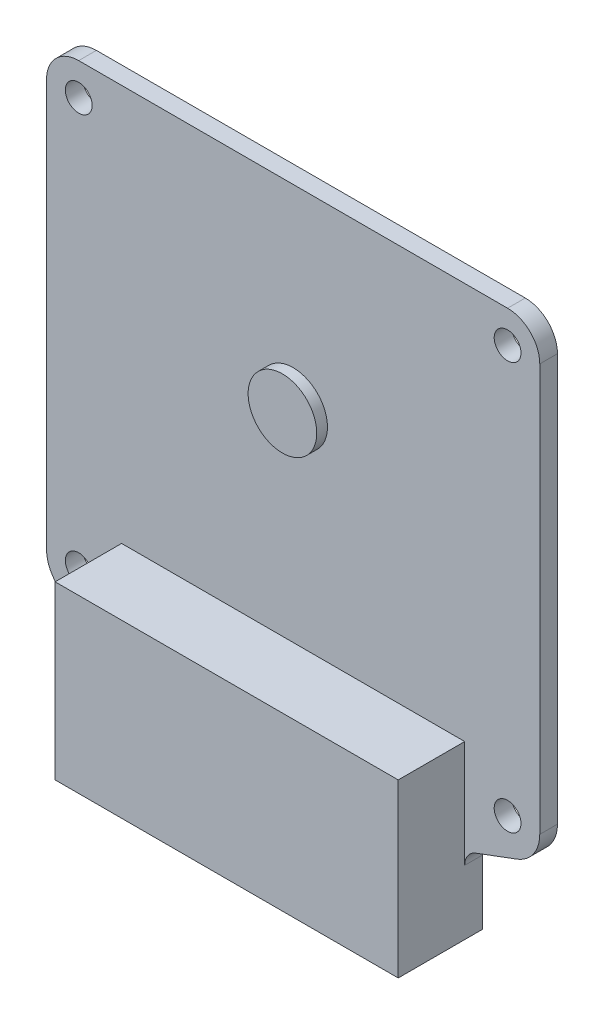
ISO-10303-21;
HEADER;
FILE_DESCRIPTION(('STEP AP214'),'2;1');
FILE_NAME('part.step','',(''),(''),'','','');
FILE_SCHEMA(('AUTOMOTIVE_DESIGN { 1 0 10303 214 1 1 1 1 }'));
ENDSEC;
DATA;
#1=APPLICATION_CONTEXT('core data for automotive mechanical design processes');
#2=APPLICATION_PROTOCOL_DEFINITION('international standard','automotive_design',2000,#1);
#3=PRODUCT_CONTEXT('',#1,'mechanical');
#4=PRODUCT('Part','Part','',(#3));
#5=PRODUCT_RELATED_PRODUCT_CATEGORY('part','',(#4));
#6=PRODUCT_DEFINITION_FORMATION('','',#4);
#7=PRODUCT_DEFINITION_CONTEXT('part definition',#1,'design');
#8=PRODUCT_DEFINITION('design','',#6,#7);
#9=PRODUCT_DEFINITION_SHAPE('','',#8);
#10=(LENGTH_UNIT() NAMED_UNIT(*) SI_UNIT(.MILLI.,.METRE.));
#11=(NAMED_UNIT(*) PLANE_ANGLE_UNIT() SI_UNIT($,.RADIAN.));
#12=(NAMED_UNIT(*) SI_UNIT($,.STERADIAN.) SOLID_ANGLE_UNIT());
#13=UNCERTAINTY_MEASURE_WITH_UNIT(LENGTH_MEASURE(1.E-05),#10,'distance_accuracy_value','');
#14=(GEOMETRIC_REPRESENTATION_CONTEXT(3) GLOBAL_UNCERTAINTY_ASSIGNED_CONTEXT((#13)) GLOBAL_UNIT_ASSIGNED_CONTEXT((#10,
#11,#12)) REPRESENTATION_CONTEXT('',''));
#15=CARTESIAN_POINT('',(0.,0.,0.));
#16=DIRECTION('',(0.,0.,1.));
#17=DIRECTION('',(1.,0.,0.));
#18=AXIS2_PLACEMENT_3D('',#15,#16,#17);
#19=CARTESIAN_POINT('',(-20.,15.,1.65));
#20=DIRECTION('',(0.,0.,1.));
#21=DIRECTION('',(1.,0.,0.));
#22=AXIS2_PLACEMENT_3D('',#19,#20,#21);
#23=PLANE('',#22);
#24=DIRECTION('',(0.,1.,0.));
#25=VECTOR('',#24,1.);
#26=CARTESIAN_POINT('',(16.,-19.,1.65));
#27=LINE('',#26,#25);
#28=CARTESIAN_POINT('',(16.,-29.,1.65));
#29=VERTEX_POINT('',#28);
#30=CARTESIAN_POINT('',(16.,-19.,1.65));
#31=VERTEX_POINT('',#30);
#32=EDGE_CURVE('E12',#29,#31,#27,.T.);
#33=ORIENTED_EDGE('',*,*,#32,.F.);
#34=CARTESIAN_POINT('',(17.61,-29.,1.65));
#35=DIRECTION('',(0.,0.,-1.));
#36=DIRECTION('',(-1.,0.,0.));
#37=AXIS2_PLACEMENT_3D('',#34,#35,#36);
#38=CIRCLE('',#37,1.61);
#39=CARTESIAN_POINT('',(17.0470544959532,-27.4916259219035,1.65));
#40=VERTEX_POINT('',#39);
#41=EDGE_CURVE('E325',#29,#40,#38,.T.);
#42=ORIENTED_EDGE('',*,*,#41,.T.);
#43=DIRECTION('',(0.936878309376722,0.34965559257563,0.));
#44=VECTOR('',#43,1.);
#45=CARTESIAN_POINT('',(20.8733737877223,-26.0635920716619,1.65));
#46=LINE('',#45,#44);
#47=CARTESIAN_POINT('',(20.8733737877223,-26.0635920716619,1.65));
#48=VERTEX_POINT('',#47);
#49=EDGE_CURVE('E333',#40,#48,#46,.T.);
#50=ORIENTED_EDGE('',*,*,#49,.T.);
#51=CARTESIAN_POINT('',(19.73,-23.,1.65));
#52=DIRECTION('',(0.,0.,1.));
#53=DIRECTION('',(-1.,0.,0.));
#54=AXIS2_PLACEMENT_3D('',#51,#52,#53);
#55=CIRCLE('',#54,3.27);
#56=CARTESIAN_POINT('',(23.,-23.,1.65));
#57=VERTEX_POINT('',#56);
#58=EDGE_CURVE('E188',#48,#57,#55,.T.);
#59=ORIENTED_EDGE('',*,*,#58,.T.);
#60=DIRECTION('',(0.,1.,0.));
#61=VECTOR('',#60,1.);
#62=CARTESIAN_POINT('',(23.,15.,1.65));
#63=LINE('',#62,#61);
#64=CARTESIAN_POINT('',(23.,15.,1.65));
#65=VERTEX_POINT('',#64);
#66=EDGE_CURVE('E181',#57,#65,#63,.T.);
#67=ORIENTED_EDGE('',*,*,#66,.T.);
#68=CARTESIAN_POINT('',(20.,15.,1.65));
#69=DIRECTION('',(0.,0.,1.));
#70=DIRECTION('',(1.,0.,0.));
#71=AXIS2_PLACEMENT_3D('',#68,#69,#70);
#72=CIRCLE('',#71,3.);
#73=CARTESIAN_POINT('',(20.,18.,1.65));
#74=VERTEX_POINT('',#73);
#75=EDGE_CURVE('E185',#65,#74,#72,.T.);
#76=ORIENTED_EDGE('',*,*,#75,.T.);
#77=DIRECTION('',(-1.,0.,0.));
#78=VECTOR('',#77,1.);
#79=CARTESIAN_POINT('',(-20.,18.,1.65));
#80=LINE('',#79,#78);
#81=CARTESIAN_POINT('',(-20.,18.,1.65));
#82=VERTEX_POINT('',#81);
#83=EDGE_CURVE('E71',#74,#82,#80,.T.);
#84=ORIENTED_EDGE('',*,*,#83,.T.);
#85=CARTESIAN_POINT('',(-20.,15.,1.65));
#86=DIRECTION('',(0.,0.,1.));
#87=DIRECTION('',(1.,0.,0.));
#88=AXIS2_PLACEMENT_3D('',#85,#86,#87);
#89=CIRCLE('',#88,3.);
#90=CARTESIAN_POINT('',(-23.,15.,1.65));
#91=VERTEX_POINT('',#90);
#92=EDGE_CURVE('E257',#82,#91,#89,.T.);
#93=ORIENTED_EDGE('',*,*,#92,.T.);
#94=DIRECTION('',(0.,-1.,0.));
#95=VECTOR('',#94,1.);
#96=CARTESIAN_POINT('',(-23.,15.,1.65));
#97=LINE('',#96,#95);
#98=CARTESIAN_POINT('',(-23.,-23.,1.65));
#99=VERTEX_POINT('',#98);
#100=EDGE_CURVE('E145',#91,#99,#97,.T.);
#101=ORIENTED_EDGE('',*,*,#100,.T.);
#102=CARTESIAN_POINT('',(-19.73,-23.,1.65));
#103=DIRECTION('',(0.,0.,1.));
#104=DIRECTION('',(1.,0.,0.));
#105=AXIS2_PLACEMENT_3D('',#102,#103,#104);
#106=CIRCLE('',#105,3.27);
#107=CARTESIAN_POINT('',(-20.8733737877223,-26.0635920716619,1.65));
#108=VERTEX_POINT('',#107);
#109=EDGE_CURVE('E322',#99,#108,#106,.T.);
#110=ORIENTED_EDGE('',*,*,#109,.T.);
#111=DIRECTION('',(0.936878309376722,-0.349655592575629,0.));
#112=VECTOR('',#111,1.);
#113=CARTESIAN_POINT('',(-20.8733737877223,-26.0635920716619,1.65));
#114=LINE('',#113,#112);
#115=CARTESIAN_POINT('',(-17.0470544959532,-27.4916259219035,1.65));
#116=VERTEX_POINT('',#115);
#117=EDGE_CURVE('E318',#108,#116,#114,.T.);
#118=ORIENTED_EDGE('',*,*,#117,.T.);
#119=CARTESIAN_POINT('',(-17.61,-29.,1.65));
#120=DIRECTION('',(0.,0.,-1.));
#121=DIRECTION('',(1.,0.,0.));
#122=AXIS2_PLACEMENT_3D('',#119,#120,#121);
#123=CIRCLE('',#122,1.61);
#124=CARTESIAN_POINT('',(-16.,-29.,1.65));
#125=VERTEX_POINT('',#124);
#126=EDGE_CURVE('E321',#116,#125,#123,.T.);
#127=ORIENTED_EDGE('',*,*,#126,.T.);
#128=DIRECTION('',(0.,-1.,0.));
#129=VECTOR('',#128,1.);
#130=CARTESIAN_POINT('',(-16.,-19.,1.65));
#131=LINE('',#130,#129);
#132=CARTESIAN_POINT('',(-16.,-19.,1.65));
#133=VERTEX_POINT('',#132);
#134=EDGE_CURVE('E393',#133,#125,#131,.T.);
#135=ORIENTED_EDGE('',*,*,#134,.F.);
#136=DIRECTION('',(-1.,0.,0.));
#137=VECTOR('',#136,1.);
#138=CARTESIAN_POINT('',(-16.,-19.,1.65));
#139=LINE('',#138,#137);
#140=EDGE_CURVE('E62',#31,#133,#139,.T.);
#141=ORIENTED_EDGE('',*,*,#140,.F.);
#142=EDGE_LOOP('',(#33,#42,#50,#59,#67,#76,#84,#93,#101,#110,#118,#127,#135,#141));
#143=FACE_BOUND('',#142,.T.);
#144=CARTESIAN_POINT('',(-20.,-23.,1.65));
#145=DIRECTION('',(0.,0.,1.));
#146=DIRECTION('',(1.,0.,0.));
#147=AXIS2_PLACEMENT_3D('',#144,#145,#146);
#148=CIRCLE('',#147,1.25);
#149=CARTESIAN_POINT('',(-18.75,-23.,1.65));
#150=VERTEX_POINT('',#149);
#151=EDGE_CURVE('E346',#150,#150,#148,.T.);
#152=ORIENTED_EDGE('',*,*,#151,.F.);
#153=EDGE_LOOP('',(#152));
#154=FACE_BOUND('',#153,.T.);
#155=CARTESIAN_POINT('',(20.,15.,1.65));
#156=DIRECTION('',(0.,0.,1.));
#157=DIRECTION('',(1.,0.,0.));
#158=AXIS2_PLACEMENT_3D('',#155,#156,#157);
#159=CIRCLE('',#158,1.25);
#160=CARTESIAN_POINT('',(21.25,15.,1.65));
#161=VERTEX_POINT('',#160);
#162=EDGE_CURVE('E367',#161,#161,#159,.T.);
#163=ORIENTED_EDGE('',*,*,#162,.F.);
#164=EDGE_LOOP('',(#163));
#165=FACE_BOUND('',#164,.T.);
#166=CARTESIAN_POINT('',(0.,0.,1.65));
#167=DIRECTION('',(0.,0.,1.));
#168=DIRECTION('',(1.,0.,0.));
#169=AXIS2_PLACEMENT_3D('',#166,#167,#168);
#170=CIRCLE('',#169,3.2);
#171=CARTESIAN_POINT('',(3.2,0.,1.65));
#172=VERTEX_POINT('',#171);
#173=EDGE_CURVE('E220',#172,#172,#170,.T.);
#174=ORIENTED_EDGE('',*,*,#173,.F.);
#175=EDGE_LOOP('',(#174));
#176=FACE_BOUND('',#175,.T.);
#177=CARTESIAN_POINT('',(-20.,15.,1.65));
#178=DIRECTION('',(0.,0.,1.));
#179=DIRECTION('',(1.,0.,0.));
#180=AXIS2_PLACEMENT_3D('',#177,#178,#179);
#181=CIRCLE('',#180,1.25);
#182=CARTESIAN_POINT('',(-18.75,15.,1.65));
#183=VERTEX_POINT('',#182);
#184=EDGE_CURVE('E359',#183,#183,#181,.T.);
#185=ORIENTED_EDGE('',*,*,#184,.F.);
#186=EDGE_LOOP('',(#185));
#187=FACE_BOUND('',#186,.T.);
#188=CARTESIAN_POINT('',(20.,-23.,1.65));
#189=DIRECTION('',(0.,0.,1.));
#190=DIRECTION('',(1.,0.,0.));
#191=AXIS2_PLACEMENT_3D('',#188,#189,#190);
#192=CIRCLE('',#191,1.25);
#193=CARTESIAN_POINT('',(21.25,-23.,1.65));
#194=VERTEX_POINT('',#193);
#195=EDGE_CURVE('E337',#194,#194,#192,.T.);
#196=ORIENTED_EDGE('',*,*,#195,.F.);
#197=EDGE_LOOP('',(#196));
#198=FACE_BOUND('',#197,.T.);
#199=ADVANCED_FACE('F42',(#143,#154,#165,#176,#187,#198),#23,.T.);
#200=CARTESIAN_POINT('',(-20.,15.,0.));
#201=DIRECTION('',(0.,0.,1.));
#202=DIRECTION('',(1.,0.,0.));
#203=AXIS2_PLACEMENT_3D('',#200,#201,#202);
#204=PLANE('',#203);
#205=CARTESIAN_POINT('',(-20.,15.,0.));
#206=DIRECTION('',(0.,0.,1.));
#207=DIRECTION('',(1.,0.,0.));
#208=AXIS2_PLACEMENT_3D('',#205,#206,#207);
#209=CIRCLE('',#208,3.);
#210=CARTESIAN_POINT('',(-20.,18.,0.));
#211=VERTEX_POINT('',#210);
#212=CARTESIAN_POINT('',(-23.,15.,0.));
#213=VERTEX_POINT('',#212);
#214=EDGE_CURVE('E215',#211,#213,#209,.T.);
#215=ORIENTED_EDGE('',*,*,#214,.F.);
#216=DIRECTION('',(-1.,0.,0.));
#217=VECTOR('',#216,1.);
#218=CARTESIAN_POINT('',(-20.,18.,0.));
#219=LINE('',#218,#217);
#220=CARTESIAN_POINT('',(20.,18.,0.));
#221=VERTEX_POINT('',#220);
#222=EDGE_CURVE('E134',#221,#211,#219,.T.);
#223=ORIENTED_EDGE('',*,*,#222,.F.);
#224=CARTESIAN_POINT('',(20.,15.,0.));
#225=DIRECTION('',(0.,0.,1.));
#226=DIRECTION('',(1.,0.,0.));
#227=AXIS2_PLACEMENT_3D('',#224,#225,#226);
#228=CIRCLE('',#227,3.);
#229=CARTESIAN_POINT('',(23.,15.,0.));
#230=VERTEX_POINT('',#229);
#231=EDGE_CURVE('E252',#230,#221,#228,.T.);
#232=ORIENTED_EDGE('',*,*,#231,.F.);
#233=DIRECTION('',(0.,1.,0.));
#234=VECTOR('',#233,1.);
#235=CARTESIAN_POINT('',(23.,15.,0.));
#236=LINE('',#235,#234);
#237=CARTESIAN_POINT('',(23.,-23.,0.));
#238=VERTEX_POINT('',#237);
#239=EDGE_CURVE('E198',#238,#230,#236,.T.);
#240=ORIENTED_EDGE('',*,*,#239,.F.);
#241=CARTESIAN_POINT('',(19.73,-23.,0.));
#242=DIRECTION('',(0.,0.,1.));
#243=DIRECTION('',(-1.,0.,0.));
#244=AXIS2_PLACEMENT_3D('',#241,#242,#243);
#245=CIRCLE('',#244,3.27);
#246=CARTESIAN_POINT('',(20.8733737877223,-26.0635920716619,0.));
#247=VERTEX_POINT('',#246);
#248=EDGE_CURVE('E247',#247,#238,#245,.T.);
#249=ORIENTED_EDGE('',*,*,#248,.F.);
#250=DIRECTION('',(0.936878309376722,0.34965559257563,0.));
#251=VECTOR('',#250,1.);
#252=CARTESIAN_POINT('',(20.8733737877223,-26.0635920716619,0.));
#253=LINE('',#252,#251);
#254=CARTESIAN_POINT('',(17.0470544959532,-27.4916259219035,0.));
#255=VERTEX_POINT('',#254);
#256=EDGE_CURVE('E244',#255,#247,#253,.T.);
#257=ORIENTED_EDGE('',*,*,#256,.F.);
#258=CARTESIAN_POINT('',(17.61,-29.,0.));
#259=DIRECTION('',(0.,0.,-1.));
#260=DIRECTION('',(-1.,0.,0.));
#261=AXIS2_PLACEMENT_3D('',#258,#259,#260);
#262=CIRCLE('',#261,1.61);
#263=CARTESIAN_POINT('',(16.,-29.,0.));
#264=VERTEX_POINT('',#263);
#265=EDGE_CURVE('E241',#264,#255,#262,.T.);
#266=ORIENTED_EDGE('',*,*,#265,.F.);
#267=DIRECTION('',(0.,1.,0.));
#268=VECTOR('',#267,1.);
#269=CARTESIAN_POINT('',(16.,-35.,0.));
#270=LINE('',#269,#268);
#271=CARTESIAN_POINT('',(16.,-35.,0.));
#272=VERTEX_POINT('',#271);
#273=EDGE_CURVE('E238',#272,#264,#270,.T.);
#274=ORIENTED_EDGE('',*,*,#273,.F.);
#275=DIRECTION('',(1.,0.,0.));
#276=VECTOR('',#275,1.);
#277=CARTESIAN_POINT('',(-16.,-35.,0.));
#278=LINE('',#277,#276);
#279=CARTESIAN_POINT('',(-16.,-35.,0.));
#280=VERTEX_POINT('',#279);
#281=EDGE_CURVE('E235',#280,#272,#278,.T.);
#282=ORIENTED_EDGE('',*,*,#281,.F.);
#283=DIRECTION('',(0.,-1.,0.));
#284=VECTOR('',#283,1.);
#285=CARTESIAN_POINT('',(-16.,-35.,0.));
#286=LINE('',#285,#284);
#287=CARTESIAN_POINT('',(-16.,-29.,0.));
#288=VERTEX_POINT('',#287);
#289=EDGE_CURVE('E232',#288,#280,#286,.T.);
#290=ORIENTED_EDGE('',*,*,#289,.F.);
#291=CARTESIAN_POINT('',(-17.61,-29.,0.));
#292=DIRECTION('',(0.,0.,-1.));
#293=DIRECTION('',(1.,0.,0.));
#294=AXIS2_PLACEMENT_3D('',#291,#292,#293);
#295=CIRCLE('',#294,1.61);
#296=CARTESIAN_POINT('',(-17.0470544959532,-27.4916259219035,0.));
#297=VERTEX_POINT('',#296);
#298=EDGE_CURVE('E229',#297,#288,#295,.T.);
#299=ORIENTED_EDGE('',*,*,#298,.F.);
#300=DIRECTION('',(0.936878309376722,-0.349655592575629,0.));
#301=VECTOR('',#300,1.);
#302=CARTESIAN_POINT('',(-20.8733737877223,-26.0635920716619,0.));
#303=LINE('',#302,#301);
#304=CARTESIAN_POINT('',(-20.8733737877223,-26.0635920716619,0.));
#305=VERTEX_POINT('',#304);
#306=EDGE_CURVE('E226',#305,#297,#303,.T.);
#307=ORIENTED_EDGE('',*,*,#306,.F.);
#308=CARTESIAN_POINT('',(-19.73,-23.,0.));
#309=DIRECTION('',(0.,0.,1.));
#310=DIRECTION('',(1.,0.,0.));
#311=AXIS2_PLACEMENT_3D('',#308,#309,#310);
#312=CIRCLE('',#311,3.27);
#313=CARTESIAN_POINT('',(-23.,-23.,0.));
#314=VERTEX_POINT('',#313);
#315=EDGE_CURVE('E223',#314,#305,#312,.T.);
#316=ORIENTED_EDGE('',*,*,#315,.F.);
#317=DIRECTION('',(0.,-1.,0.));
#318=VECTOR('',#317,1.);
#319=CARTESIAN_POINT('',(-23.,15.,0.));
#320=LINE('',#319,#318);
#321=EDGE_CURVE('E219',#213,#314,#320,.T.);
#322=ORIENTED_EDGE('',*,*,#321,.F.);
#323=EDGE_LOOP('',(#215,#223,#232,#240,#249,#257,#266,#274,#282,#290,#299,#307,#316,#322));
#324=FACE_BOUND('',#323,.T.);
#325=CARTESIAN_POINT('',(20.,15.,0.));
#326=DIRECTION('',(0.,0.,1.));
#327=DIRECTION('',(1.,0.,0.));
#328=AXIS2_PLACEMENT_3D('',#325,#326,#327);
#329=CIRCLE('',#328,1.25);
#330=CARTESIAN_POINT('',(21.25,15.,0.));
#331=VERTEX_POINT('',#330);
#332=EDGE_CURVE('E363',#331,#331,#329,.T.);
#333=ORIENTED_EDGE('',*,*,#332,.T.);
#334=EDGE_LOOP('',(#333));
#335=FACE_BOUND('',#334,.T.);
#336=CARTESIAN_POINT('',(-20.,15.,0.));
#337=DIRECTION('',(0.,0.,1.));
#338=DIRECTION('',(1.,0.,0.));
#339=AXIS2_PLACEMENT_3D('',#336,#337,#338);
#340=CIRCLE('',#339,1.25);
#341=CARTESIAN_POINT('',(-18.75,15.,0.));
#342=VERTEX_POINT('',#341);
#343=EDGE_CURVE('E357',#342,#342,#340,.T.);
#344=ORIENTED_EDGE('',*,*,#343,.T.);
#345=EDGE_LOOP('',(#344));
#346=FACE_BOUND('',#345,.T.);
#347=CARTESIAN_POINT('',(-20.,-23.,0.));
#348=DIRECTION('',(0.,0.,1.));
#349=DIRECTION('',(1.,0.,0.));
#350=AXIS2_PLACEMENT_3D('',#347,#348,#349);
#351=CIRCLE('',#350,1.25);
#352=CARTESIAN_POINT('',(-18.75,-23.,0.));
#353=VERTEX_POINT('',#352);
#354=EDGE_CURVE('E339',#353,#353,#351,.T.);
#355=ORIENTED_EDGE('',*,*,#354,.T.);
#356=EDGE_LOOP('',(#355));
#357=FACE_BOUND('',#356,.T.);
#358=CARTESIAN_POINT('',(20.,-23.,0.));
#359=DIRECTION('',(0.,0.,1.));
#360=DIRECTION('',(1.,0.,0.));
#361=AXIS2_PLACEMENT_3D('',#358,#359,#360);
#362=CIRCLE('',#361,1.25);
#363=CARTESIAN_POINT('',(21.25,-23.,0.));
#364=VERTEX_POINT('',#363);
#365=EDGE_CURVE('E340',#364,#364,#362,.T.);
#366=ORIENTED_EDGE('',*,*,#365,.T.);
#367=EDGE_LOOP('',(#366));
#368=FACE_BOUND('',#367,.T.);
#369=ADVANCED_FACE('F308',(#324,#335,#346,#357,#368),#204,.F.);
#370=CARTESIAN_POINT('',(-20.,15.,1.65));
#371=DIRECTION('',(0.,0.,-1.));
#372=DIRECTION('',(-1.,0.,0.));
#373=AXIS2_PLACEMENT_3D('',#370,#371,#372);
#374=CYLINDRICAL_SURFACE('',#373,3.);
#375=ORIENTED_EDGE('',*,*,#214,.T.);
#376=DIRECTION('',(0.,0.,-1.));
#377=VECTOR('',#376,1.);
#378=CARTESIAN_POINT('',(-23.,15.,1.65));
#379=LINE('',#378,#377);
#380=EDGE_CURVE('E46',#91,#213,#379,.T.);
#381=ORIENTED_EDGE('',*,*,#380,.F.);
#382=ORIENTED_EDGE('',*,*,#92,.F.);
#383=DIRECTION('',(0.,0.,-1.));
#384=VECTOR('',#383,1.);
#385=CARTESIAN_POINT('',(-20.,18.,1.65));
#386=LINE('',#385,#384);
#387=EDGE_CURVE('E211',#82,#211,#386,.T.);
#388=ORIENTED_EDGE('',*,*,#387,.T.);
#389=EDGE_LOOP('',(#375,#381,#382,#388));
#390=FACE_BOUND('',#389,.T.);
#391=ADVANCED_FACE('F44',(#390),#374,.T.);
#392=CARTESIAN_POINT('',(-23.,15.,1.65));
#393=DIRECTION('',(1.,0.,0.));
#394=DIRECTION('',(0.,1.,0.));
#395=AXIS2_PLACEMENT_3D('',#392,#393,#394);
#396=PLANE('',#395);
#397=ORIENTED_EDGE('',*,*,#321,.T.);
#398=DIRECTION('',(0.,0.,-1.));
#399=VECTOR('',#398,1.);
#400=CARTESIAN_POINT('',(-23.,-23.,1.65));
#401=LINE('',#400,#399);
#402=EDGE_CURVE('E294',#99,#314,#401,.T.);
#403=ORIENTED_EDGE('',*,*,#402,.F.);
#404=ORIENTED_EDGE('',*,*,#100,.F.);
#405=ORIENTED_EDGE('',*,*,#380,.T.);
#406=EDGE_LOOP('',(#397,#403,#404,#405));
#407=FACE_BOUND('',#406,.T.);
#408=ADVANCED_FACE('F303',(#407),#396,.F.);
#409=CARTESIAN_POINT('',(-19.73,-23.,1.65));
#410=DIRECTION('',(0.,0.,-1.));
#411=DIRECTION('',(-1.,0.,0.));
#412=AXIS2_PLACEMENT_3D('',#409,#410,#411);
#413=CYLINDRICAL_SURFACE('',#412,3.27);
#414=ORIENTED_EDGE('',*,*,#315,.T.);
#415=DIRECTION('',(0.,0.,-1.));
#416=VECTOR('',#415,1.);
#417=CARTESIAN_POINT('',(-20.8733737877223,-26.0635920716619,1.65));
#418=LINE('',#417,#416);
#419=EDGE_CURVE('E291',#108,#305,#418,.T.);
#420=ORIENTED_EDGE('',*,*,#419,.F.);
#421=ORIENTED_EDGE('',*,*,#109,.F.);
#422=ORIENTED_EDGE('',*,*,#402,.T.);
#423=EDGE_LOOP('',(#414,#420,#421,#422));
#424=FACE_BOUND('',#423,.T.);
#425=ADVANCED_FACE('F313',(#424),#413,.T.);
#426=CARTESIAN_POINT('',(-20.8733737877223,-26.0635920716619,1.65));
#427=DIRECTION('',(0.349655592575629,0.936878309376722,0.));
#428=DIRECTION('',(-0.936878309376722,0.349655592575629,0.));
#429=AXIS2_PLACEMENT_3D('',#426,#427,#428);
#430=PLANE('',#429);
#431=ORIENTED_EDGE('',*,*,#306,.T.);
#432=DIRECTION('',(0.,0.,-1.));
#433=VECTOR('',#432,1.);
#434=CARTESIAN_POINT('',(-17.0470544959532,-27.4916259219035,1.65));
#435=LINE('',#434,#433);
#436=EDGE_CURVE('E287',#116,#297,#435,.T.);
#437=ORIENTED_EDGE('',*,*,#436,.F.);
#438=ORIENTED_EDGE('',*,*,#117,.F.);
#439=ORIENTED_EDGE('',*,*,#419,.T.);
#440=EDGE_LOOP('',(#431,#437,#438,#439));
#441=FACE_BOUND('',#440,.T.);
#442=ADVANCED_FACE('F316',(#441),#430,.F.);
#443=CARTESIAN_POINT('',(-17.61,-29.,1.65));
#444=DIRECTION('',(0.,0.,-1.));
#445=DIRECTION('',(-1.,0.,0.));
#446=AXIS2_PLACEMENT_3D('',#443,#444,#445);
#447=CYLINDRICAL_SURFACE('',#446,1.61);
#448=ORIENTED_EDGE('',*,*,#298,.T.);
#449=DIRECTION('',(0.,0.,-1.));
#450=VECTOR('',#449,1.);
#451=CARTESIAN_POINT('',(-16.,-29.,1.65));
#452=LINE('',#451,#450);
#453=EDGE_CURVE('E283',#125,#288,#452,.T.);
#454=ORIENTED_EDGE('',*,*,#453,.F.);
#455=ORIENTED_EDGE('',*,*,#126,.F.);
#456=ORIENTED_EDGE('',*,*,#436,.T.);
#457=EDGE_LOOP('',(#448,#454,#455,#456));
#458=FACE_BOUND('',#457,.T.);
#459=ADVANCED_FACE('F466',(#458),#447,.F.);
#460=CARTESIAN_POINT('',(-16.,-35.,1.65));
#461=DIRECTION('',(1.,0.,0.));
#462=DIRECTION('',(0.,0.,-1.));
#463=AXIS2_PLACEMENT_3D('',#460,#461,#462);
#464=PLANE('',#463);
#465=ORIENTED_EDGE('',*,*,#289,.T.);
#466=DIRECTION('',(0.,0.,-1.));
#467=VECTOR('',#466,1.);
#468=CARTESIAN_POINT('',(-16.,-35.,1.65));
#469=LINE('',#468,#467);
#470=CARTESIAN_POINT('',(-16.,-35.,7.85));
#471=VERTEX_POINT('',#470);
#472=EDGE_CURVE('E279',#471,#280,#469,.T.);
#473=ORIENTED_EDGE('',*,*,#472,.F.);
#474=DIRECTION('',(0.,-1.,0.));
#475=VECTOR('',#474,1.);
#476=CARTESIAN_POINT('',(-16.,-19.,7.85));
#477=LINE('',#476,#475);
#478=CARTESIAN_POINT('',(-16.,-19.,7.85));
#479=VERTEX_POINT('',#478);
#480=EDGE_CURVE('E381',#479,#471,#477,.T.);
#481=ORIENTED_EDGE('',*,*,#480,.F.);
#482=DIRECTION('',(0.,0.,-1.));
#483=VECTOR('',#482,1.);
#484=CARTESIAN_POINT('',(-16.,-19.,7.85));
#485=LINE('',#484,#483);
#486=EDGE_CURVE('E380',#479,#133,#485,.T.);
#487=ORIENTED_EDGE('',*,*,#486,.T.);
#488=ORIENTED_EDGE('',*,*,#134,.T.);
#489=ORIENTED_EDGE('',*,*,#453,.T.);
#490=EDGE_LOOP('',(#465,#473,#481,#487,#488,#489));
#491=FACE_BOUND('',#490,.T.);
#492=ADVANCED_FACE('F462',(#491),#464,.F.);
#493=CARTESIAN_POINT('',(-16.,-35.,1.65));
#494=DIRECTION('',(0.,1.,0.));
#495=DIRECTION('',(0.,0.,1.));
#496=AXIS2_PLACEMENT_3D('',#493,#494,#495);
#497=PLANE('',#496);
#498=ORIENTED_EDGE('',*,*,#281,.T.);
#499=DIRECTION('',(0.,0.,-1.));
#500=VECTOR('',#499,1.);
#501=CARTESIAN_POINT('',(16.,-35.,1.65));
#502=LINE('',#501,#500);
#503=CARTESIAN_POINT('',(16.,-35.,7.85));
#504=VERTEX_POINT('',#503);
#505=EDGE_CURVE('E275',#504,#272,#502,.T.);
#506=ORIENTED_EDGE('',*,*,#505,.F.);
#507=DIRECTION('',(1.,0.,0.));
#508=VECTOR('',#507,1.);
#509=CARTESIAN_POINT('',(-16.,-35.,7.85));
#510=LINE('',#509,#508);
#511=EDGE_CURVE('E384',#471,#504,#510,.T.);
#512=ORIENTED_EDGE('',*,*,#511,.F.);
#513=ORIENTED_EDGE('',*,*,#472,.T.);
#514=EDGE_LOOP('',(#498,#506,#512,#513));
#515=FACE_BOUND('',#514,.T.);
#516=ADVANCED_FACE('F458',(#515),#497,.F.);
#517=CARTESIAN_POINT('',(16.,-35.,1.65));
#518=DIRECTION('',(-1.,0.,0.));
#519=DIRECTION('',(0.,-1.,0.));
#520=AXIS2_PLACEMENT_3D('',#517,#518,#519);
#521=PLANE('',#520);
#522=ORIENTED_EDGE('',*,*,#273,.T.);
#523=DIRECTION('',(0.,0.,-1.));
#524=VECTOR('',#523,1.);
#525=CARTESIAN_POINT('',(16.,-29.,1.65));
#526=LINE('',#525,#524);
#527=EDGE_CURVE('E272',#29,#264,#526,.T.);
#528=ORIENTED_EDGE('',*,*,#527,.F.);
#529=ORIENTED_EDGE('',*,*,#32,.T.);
#530=DIRECTION('',(0.,0.,-1.));
#531=VECTOR('',#530,1.);
#532=CARTESIAN_POINT('',(16.,-19.,7.85));
#533=LINE('',#532,#531);
#534=CARTESIAN_POINT('',(16.,-19.,7.85));
#535=VERTEX_POINT('',#534);
#536=EDGE_CURVE('E350',#535,#31,#533,.T.);
#537=ORIENTED_EDGE('',*,*,#536,.F.);
#538=DIRECTION('',(0.,1.,0.));
#539=VECTOR('',#538,1.);
#540=CARTESIAN_POINT('',(16.,-19.,7.85));
#541=LINE('',#540,#539);
#542=EDGE_CURVE('E388',#504,#535,#541,.T.);
#543=ORIENTED_EDGE('',*,*,#542,.F.);
#544=ORIENTED_EDGE('',*,*,#505,.T.);
#545=EDGE_LOOP('',(#522,#528,#529,#537,#543,#544));
#546=FACE_BOUND('',#545,.T.);
#547=ADVANCED_FACE('F454',(#546),#521,.F.);
#548=CARTESIAN_POINT('',(17.61,-29.,1.65));
#549=DIRECTION('',(0.,0.,-1.));
#550=DIRECTION('',(-1.,0.,0.));
#551=AXIS2_PLACEMENT_3D('',#548,#549,#550);
#552=CYLINDRICAL_SURFACE('',#551,1.61);
#553=ORIENTED_EDGE('',*,*,#265,.T.);
#554=DIRECTION('',(0.,0.,-1.));
#555=VECTOR('',#554,1.);
#556=CARTESIAN_POINT('',(17.0470544959532,-27.4916259219035,1.65));
#557=LINE('',#556,#555);
#558=EDGE_CURVE('E268',#40,#255,#557,.T.);
#559=ORIENTED_EDGE('',*,*,#558,.F.);
#560=ORIENTED_EDGE('',*,*,#41,.F.);
#561=ORIENTED_EDGE('',*,*,#527,.T.);
#562=EDGE_LOOP('',(#553,#559,#560,#561));
#563=FACE_BOUND('',#562,.T.);
#564=ADVANCED_FACE('F450',(#563),#552,.F.);
#565=CARTESIAN_POINT('',(20.8733737877223,-26.0635920716619,1.65));
#566=DIRECTION('',(-0.34965559257563,0.936878309376722,0.));
#567=DIRECTION('',(-0.936878309376722,-0.34965559257563,0.));
#568=AXIS2_PLACEMENT_3D('',#565,#566,#567);
#569=PLANE('',#568);
#570=ORIENTED_EDGE('',*,*,#256,.T.);
#571=DIRECTION('',(0.,0.,-1.));
#572=VECTOR('',#571,1.);
#573=CARTESIAN_POINT('',(20.8733737877223,-26.0635920716619,1.65));
#574=LINE('',#573,#572);
#575=EDGE_CURVE('E264',#48,#247,#574,.T.);
#576=ORIENTED_EDGE('',*,*,#575,.F.);
#577=ORIENTED_EDGE('',*,*,#49,.F.);
#578=ORIENTED_EDGE('',*,*,#558,.T.);
#579=EDGE_LOOP('',(#570,#576,#577,#578));
#580=FACE_BOUND('',#579,.T.);
#581=ADVANCED_FACE('F446',(#580),#569,.F.);
#582=CARTESIAN_POINT('',(19.73,-23.,1.65));
#583=DIRECTION('',(0.,0.,-1.));
#584=DIRECTION('',(-1.,0.,0.));
#585=AXIS2_PLACEMENT_3D('',#582,#583,#584);
#586=CYLINDRICAL_SURFACE('',#585,3.27);
#587=ORIENTED_EDGE('',*,*,#248,.T.);
#588=DIRECTION('',(0.,0.,-1.));
#589=VECTOR('',#588,1.);
#590=CARTESIAN_POINT('',(23.,-23.,1.65));
#591=LINE('',#590,#589);
#592=EDGE_CURVE('E202',#57,#238,#591,.T.);
#593=ORIENTED_EDGE('',*,*,#592,.F.);
#594=ORIENTED_EDGE('',*,*,#58,.F.);
#595=ORIENTED_EDGE('',*,*,#575,.T.);
#596=EDGE_LOOP('',(#587,#593,#594,#595));
#597=FACE_BOUND('',#596,.T.);
#598=ADVANCED_FACE('F443',(#597),#586,.T.);
#599=CARTESIAN_POINT('',(23.,15.,1.65));
#600=DIRECTION('',(-1.,0.,0.));
#601=DIRECTION('',(0.,-1.,0.));
#602=AXIS2_PLACEMENT_3D('',#599,#600,#601);
#603=PLANE('',#602);
#604=ORIENTED_EDGE('',*,*,#239,.T.);
#605=DIRECTION('',(0.,0.,-1.));
#606=VECTOR('',#605,1.);
#607=CARTESIAN_POINT('',(23.,15.,1.65));
#608=LINE('',#607,#606);
#609=EDGE_CURVE('E195',#65,#230,#608,.T.);
#610=ORIENTED_EDGE('',*,*,#609,.F.);
#611=ORIENTED_EDGE('',*,*,#66,.F.);
#612=ORIENTED_EDGE('',*,*,#592,.T.);
#613=EDGE_LOOP('',(#604,#610,#611,#612));
#614=FACE_BOUND('',#613,.T.);
#615=ADVANCED_FACE('F196',(#614),#603,.F.);
#616=CARTESIAN_POINT('',(20.,15.,1.65));
#617=DIRECTION('',(0.,0.,-1.));
#618=DIRECTION('',(-1.,0.,0.));
#619=AXIS2_PLACEMENT_3D('',#616,#617,#618);
#620=CYLINDRICAL_SURFACE('',#619,3.);
#621=ORIENTED_EDGE('',*,*,#231,.T.);
#622=DIRECTION('',(0.,0.,-1.));
#623=VECTOR('',#622,1.);
#624=CARTESIAN_POINT('',(20.,18.,1.65));
#625=LINE('',#624,#623);
#626=EDGE_CURVE('E203',#74,#221,#625,.T.);
#627=ORIENTED_EDGE('',*,*,#626,.F.);
#628=ORIENTED_EDGE('',*,*,#75,.F.);
#629=ORIENTED_EDGE('',*,*,#609,.T.);
#630=EDGE_LOOP('',(#621,#627,#628,#629));
#631=FACE_BOUND('',#630,.T.);
#632=ADVANCED_FACE('F205',(#631),#620,.T.);
#633=CARTESIAN_POINT('',(-20.,18.,1.65));
#634=DIRECTION('',(0.,-1.,0.));
#635=DIRECTION('',(0.,0.,-1.));
#636=AXIS2_PLACEMENT_3D('',#633,#634,#635);
#637=PLANE('',#636);
#638=ORIENTED_EDGE('',*,*,#222,.T.);
#639=ORIENTED_EDGE('',*,*,#387,.F.);
#640=ORIENTED_EDGE('',*,*,#83,.F.);
#641=ORIENTED_EDGE('',*,*,#626,.T.);
#642=EDGE_LOOP('',(#638,#639,#640,#641));
#643=FACE_BOUND('',#642,.T.);
#644=ADVANCED_FACE('F436',(#643),#637,.F.);
#645=CARTESIAN_POINT('',(20.,15.,1.65));
#646=DIRECTION('',(0.,0.,-1.));
#647=DIRECTION('',(-1.,0.,0.));
#648=AXIS2_PLACEMENT_3D('',#645,#646,#647);
#649=CYLINDRICAL_SURFACE('',#648,1.25);
#650=ORIENTED_EDGE('',*,*,#162,.T.);
#651=EDGE_LOOP('',(#650));
#652=FACE_BOUND('',#651,.T.);
#653=ORIENTED_EDGE('',*,*,#332,.F.);
#654=EDGE_LOOP('',(#653));
#655=FACE_BOUND('',#654,.T.);
#656=ADVANCED_FACE('F433',(#652,#655),#649,.F.);
#657=CARTESIAN_POINT('',(-20.,15.,1.65));
#658=DIRECTION('',(0.,0.,-1.));
#659=DIRECTION('',(-1.,0.,0.));
#660=AXIS2_PLACEMENT_3D('',#657,#658,#659);
#661=CYLINDRICAL_SURFACE('',#660,1.25);
#662=ORIENTED_EDGE('',*,*,#184,.T.);
#663=EDGE_LOOP('',(#662));
#664=FACE_BOUND('',#663,.T.);
#665=ORIENTED_EDGE('',*,*,#343,.F.);
#666=EDGE_LOOP('',(#665));
#667=FACE_BOUND('',#666,.T.);
#668=ADVANCED_FACE('F571',(#664,#667),#661,.F.);
#669=CARTESIAN_POINT('',(-20.,-23.,1.65));
#670=DIRECTION('',(0.,0.,-1.));
#671=DIRECTION('',(-1.,0.,0.));
#672=AXIS2_PLACEMENT_3D('',#669,#670,#671);
#673=CYLINDRICAL_SURFACE('',#672,1.25);
#674=ORIENTED_EDGE('',*,*,#151,.T.);
#675=EDGE_LOOP('',(#674));
#676=FACE_BOUND('',#675,.T.);
#677=ORIENTED_EDGE('',*,*,#354,.F.);
#678=EDGE_LOOP('',(#677));
#679=FACE_BOUND('',#678,.T.);
#680=ADVANCED_FACE('F579',(#676,#679),#673,.F.);
#681=CARTESIAN_POINT('',(20.,-23.,1.65));
#682=DIRECTION('',(0.,0.,-1.));
#683=DIRECTION('',(-1.,0.,0.));
#684=AXIS2_PLACEMENT_3D('',#681,#682,#683);
#685=CYLINDRICAL_SURFACE('',#684,1.25);
#686=ORIENTED_EDGE('',*,*,#195,.T.);
#687=EDGE_LOOP('',(#686));
#688=FACE_BOUND('',#687,.T.);
#689=ORIENTED_EDGE('',*,*,#365,.F.);
#690=EDGE_LOOP('',(#689));
#691=FACE_BOUND('',#690,.T.);
#692=ADVANCED_FACE('F510',(#688,#691),#685,.F.);
#693=CARTESIAN_POINT('',(-16.,-19.,7.85));
#694=DIRECTION('',(0.,-1.,0.));
#695=DIRECTION('',(0.,0.,-1.));
#696=AXIS2_PLACEMENT_3D('',#693,#694,#695);
#697=PLANE('',#696);
#698=ORIENTED_EDGE('',*,*,#140,.T.);
#699=ORIENTED_EDGE('',*,*,#486,.F.);
#700=DIRECTION('',(-1.,0.,0.));
#701=VECTOR('',#700,1.);
#702=CARTESIAN_POINT('',(-16.,-19.,7.85));
#703=LINE('',#702,#701);
#704=EDGE_CURVE('E385',#535,#479,#703,.T.);
#705=ORIENTED_EDGE('',*,*,#704,.F.);
#706=ORIENTED_EDGE('',*,*,#536,.T.);
#707=EDGE_LOOP('',(#698,#699,#705,#706));
#708=FACE_BOUND('',#707,.T.);
#709=ADVANCED_FACE('F423',(#708),#697,.F.);
#710=CARTESIAN_POINT('',(0.,0.,7.85));
#711=DIRECTION('',(0.,0.,1.));
#712=DIRECTION('',(1.,0.,0.));
#713=AXIS2_PLACEMENT_3D('',#710,#711,#712);
#714=PLANE('',#713);
#715=ORIENTED_EDGE('',*,*,#542,.T.);
#716=ORIENTED_EDGE('',*,*,#704,.T.);
#717=ORIENTED_EDGE('',*,*,#480,.T.);
#718=ORIENTED_EDGE('',*,*,#511,.T.);
#719=EDGE_LOOP('',(#715,#716,#717,#718));
#720=FACE_BOUND('',#719,.T.);
#721=ADVANCED_FACE('F415',(#720),#714,.T.);
#722=CARTESIAN_POINT('',(0.,0.,12.7009667991878));
#723=DIRECTION('',(0.,0.,-1.));
#724=DIRECTION('',(-1.,0.,0.));
#725=AXIS2_PLACEMENT_3D('',#722,#723,#724);
#726=CYLINDRICAL_SURFACE('',#725,3.2);
#727=ORIENTED_EDGE('',*,*,#173,.T.);
#728=EDGE_LOOP('',(#727));
#729=FACE_BOUND('',#728,.T.);
#730=CARTESIAN_POINT('',(0.,0.,2.65));
#731=DIRECTION('',(0.,0.,1.));
#732=DIRECTION('',(1.,0.,0.));
#733=AXIS2_PLACEMENT_3D('',#730,#731,#732);
#734=CIRCLE('',#733,3.2);
#735=CARTESIAN_POINT('',(3.2,0.,2.65));
#736=VERTEX_POINT('',#735);
#737=EDGE_CURVE('E401',#736,#736,#734,.T.);
#738=ORIENTED_EDGE('',*,*,#737,.F.);
#739=EDGE_LOOP('',(#738));
#740=FACE_BOUND('',#739,.T.);
#741=ADVANCED_FACE('F413',(#729,#740),#726,.T.);
#742=CARTESIAN_POINT('',(-20.,15.,2.65));
#743=DIRECTION('',(0.,0.,1.));
#744=DIRECTION('',(1.,0.,0.));
#745=AXIS2_PLACEMENT_3D('',#742,#743,#744);
#746=PLANE('',#745);
#747=ORIENTED_EDGE('',*,*,#737,.T.);
#748=EDGE_LOOP('',(#747));
#749=FACE_BOUND('',#748,.T.);
#750=ADVANCED_FACE('F411',(#749),#746,.T.);
#751=CLOSED_SHELL('',(#199,#369,#391,#408,#425,#442,#459,#492,#516,#547,#564,#581,#598,#615,
#632,#644,#656,#668,#680,#692,#709,#721,#741,#750));
#752=MANIFOLD_SOLID_BREP('B2',#751);
#753=ADVANCED_BREP_SHAPE_REPRESENTATION('',(#18,#752),#14);
#754=SHAPE_DEFINITION_REPRESENTATION(#9,#753);
ENDSEC;
END-ISO-10303-21;
